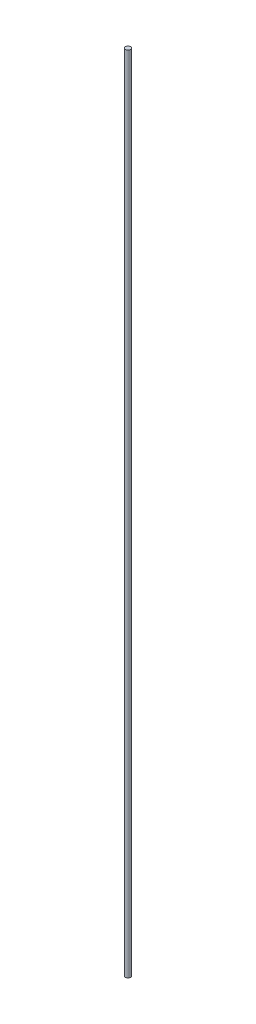
ISO-10303-21;
HEADER;
FILE_DESCRIPTION(('STEP AP214'),'2;1');
FILE_NAME('part.step','',(''),(''),'','','');
FILE_SCHEMA(('AUTOMOTIVE_DESIGN { 1 0 10303 214 1 1 1 1 }'));
ENDSEC;
DATA;
#1=APPLICATION_CONTEXT('core data for automotive mechanical design processes');
#2=APPLICATION_PROTOCOL_DEFINITION('international standard','automotive_design',2000,#1);
#3=PRODUCT_CONTEXT('',#1,'mechanical');
#4=PRODUCT('Part','Part','',(#3));
#5=PRODUCT_RELATED_PRODUCT_CATEGORY('part','',(#4));
#6=PRODUCT_DEFINITION_FORMATION('','',#4);
#7=PRODUCT_DEFINITION_CONTEXT('part definition',#1,'design');
#8=PRODUCT_DEFINITION('design','',#6,#7);
#9=PRODUCT_DEFINITION_SHAPE('','',#8);
#10=(LENGTH_UNIT() NAMED_UNIT(*) SI_UNIT(.MILLI.,.METRE.));
#11=(NAMED_UNIT(*) PLANE_ANGLE_UNIT() SI_UNIT($,.RADIAN.));
#12=(NAMED_UNIT(*) SI_UNIT($,.STERADIAN.) SOLID_ANGLE_UNIT());
#13=UNCERTAINTY_MEASURE_WITH_UNIT(LENGTH_MEASURE(1.E-05),#10,'distance_accuracy_value','');
#14=(GEOMETRIC_REPRESENTATION_CONTEXT(3) GLOBAL_UNCERTAINTY_ASSIGNED_CONTEXT((#13)) GLOBAL_UNIT_ASSIGNED_CONTEXT((#10,
#11,#12)) REPRESENTATION_CONTEXT('',''));
#15=CARTESIAN_POINT('',(0.,0.,0.));
#16=DIRECTION('',(0.,0.,1.));
#17=DIRECTION('',(1.,0.,0.));
#18=AXIS2_PLACEMENT_3D('',#15,#16,#17);
#19=CARTESIAN_POINT('',(0.,500.,0.));
#20=DIRECTION('',(0.,-1.,0.));
#21=DIRECTION('',(0.,0.,-1.));
#22=AXIS2_PLACEMENT_3D('',#19,#20,#21);
#23=CYLINDRICAL_SURFACE('',#22,3.175);
#24=CARTESIAN_POINT('',(0.,500.,0.));
#25=DIRECTION('',(0.,1.,0.));
#26=DIRECTION('',(0.,0.,1.));
#27=AXIS2_PLACEMENT_3D('',#24,#25,#26);
#28=CIRCLE('',#27,3.175);
#29=CARTESIAN_POINT('',(0.,500.,3.175));
#30=VERTEX_POINT('',#29);
#31=EDGE_CURVE('E10',#30,#30,#28,.T.);
#32=ORIENTED_EDGE('',*,*,#31,.F.);
#33=EDGE_LOOP('',(#32));
#34=FACE_BOUND('',#33,.T.);
#35=CARTESIAN_POINT('',(0.,-500.,0.));
#36=DIRECTION('',(0.,1.,0.));
#37=DIRECTION('',(0.,0.,1.));
#38=AXIS2_PLACEMENT_3D('',#35,#36,#37);
#39=CIRCLE('',#38,3.175);
#40=CARTESIAN_POINT('',(0.,-500.,3.175));
#41=VERTEX_POINT('',#40);
#42=EDGE_CURVE('E36',#41,#41,#39,.T.);
#43=ORIENTED_EDGE('',*,*,#42,.T.);
#44=EDGE_LOOP('',(#43));
#45=FACE_BOUND('',#44,.T.);
#46=ADVANCED_FACE('F33',(#34,#45),#23,.T.);
#47=CARTESIAN_POINT('',(0.,500.,0.));
#48=DIRECTION('',(0.,1.,0.));
#49=DIRECTION('',(0.,0.,1.));
#50=AXIS2_PLACEMENT_3D('',#47,#48,#49);
#51=PLANE('',#50);
#52=ORIENTED_EDGE('',*,*,#31,.T.);
#53=EDGE_LOOP('',(#52));
#54=FACE_BOUND('',#53,.T.);
#55=ADVANCED_FACE('F48',(#54),#51,.T.);
#56=CARTESIAN_POINT('',(0.,-500.,0.));
#57=DIRECTION('',(0.,1.,0.));
#58=DIRECTION('',(0.,0.,1.));
#59=AXIS2_PLACEMENT_3D('',#56,#57,#58);
#60=PLANE('',#59);
#61=ORIENTED_EDGE('',*,*,#42,.F.);
#62=EDGE_LOOP('',(#61));
#63=FACE_BOUND('',#62,.T.);
#64=ADVANCED_FACE('F46',(#63),#60,.F.);
#65=CLOSED_SHELL('',(#46,#55,#64));
#66=MANIFOLD_SOLID_BREP('B2',#65);
#67=ADVANCED_BREP_SHAPE_REPRESENTATION('',(#18,#66),#14);
#68=SHAPE_DEFINITION_REPRESENTATION(#9,#67);
ENDSEC;
END-ISO-10303-21;
